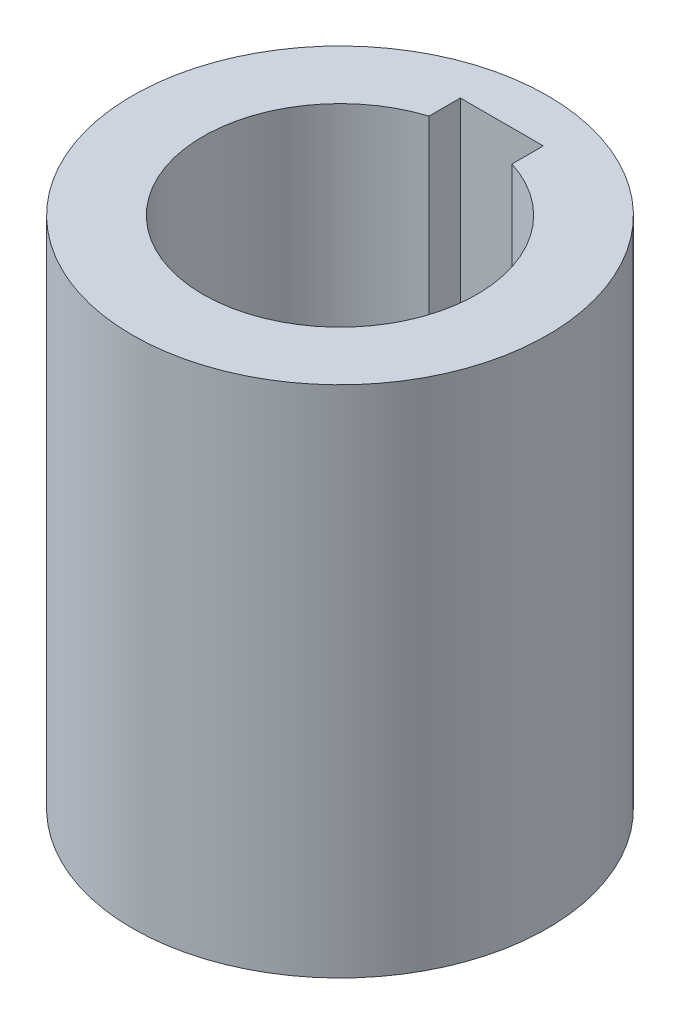
ISO-10303-21;
HEADER;
FILE_DESCRIPTION(('STEP AP214'),'2;1');
FILE_NAME('part.step','',(''),(''),'','','');
FILE_SCHEMA(('AUTOMOTIVE_DESIGN { 1 0 10303 214 1 1 1 1 }'));
ENDSEC;
DATA;
#1=APPLICATION_CONTEXT('core data for automotive mechanical design processes');
#2=APPLICATION_PROTOCOL_DEFINITION('international standard','automotive_design',2000,#1);
#3=PRODUCT_CONTEXT('',#1,'mechanical');
#4=PRODUCT('Part','Part','',(#3));
#5=PRODUCT_RELATED_PRODUCT_CATEGORY('part','',(#4));
#6=PRODUCT_DEFINITION_FORMATION('','',#4);
#7=PRODUCT_DEFINITION_CONTEXT('part definition',#1,'design');
#8=PRODUCT_DEFINITION('design','',#6,#7);
#9=PRODUCT_DEFINITION_SHAPE('','',#8);
#10=(LENGTH_UNIT() NAMED_UNIT(*) SI_UNIT(.MILLI.,.METRE.));
#11=(NAMED_UNIT(*) PLANE_ANGLE_UNIT() SI_UNIT($,.RADIAN.));
#12=(NAMED_UNIT(*) SI_UNIT($,.STERADIAN.) SOLID_ANGLE_UNIT());
#13=UNCERTAINTY_MEASURE_WITH_UNIT(LENGTH_MEASURE(1.E-05),#10,'distance_accuracy_value','');
#14=(GEOMETRIC_REPRESENTATION_CONTEXT(3) GLOBAL_UNCERTAINTY_ASSIGNED_CONTEXT((#13)) GLOBAL_UNIT_ASSIGNED_CONTEXT((#10,
#11,#12)) REPRESENTATION_CONTEXT('',''));
#15=CARTESIAN_POINT('',(0.,0.,0.));
#16=DIRECTION('',(0.,0.,1.));
#17=DIRECTION('',(1.,0.,0.));
#18=AXIS2_PLACEMENT_3D('',#15,#16,#17);
#19=CARTESIAN_POINT('',(0.,123.8,0.));
#20=DIRECTION('',(0.,1.,0.));
#21=DIRECTION('',(0.,0.,1.));
#22=AXIS2_PLACEMENT_3D('',#19,#20,#21);
#23=PLANE('',#22);
#24=DIRECTION('',(0.,0.,-1.));
#25=VECTOR('',#24,1.);
#26=CARTESIAN_POINT('',(10.,123.8,0.));
#27=LINE('',#26,#25);
#28=CARTESIAN_POINT('',(10.,123.8,-31.4483703870328));
#29=VERTEX_POINT('',#28);
#30=CARTESIAN_POINT('',(10.,123.8,-39.));
#31=VERTEX_POINT('',#30);
#32=EDGE_CURVE('E76',#29,#31,#27,.T.);
#33=ORIENTED_EDGE('',*,*,#32,.F.);
#34=CARTESIAN_POINT('',(0.,123.8,0.));
#35=DIRECTION('',(0.,1.,0.));
#36=DIRECTION('',(0.,0.,1.));
#37=AXIS2_PLACEMENT_3D('',#34,#35,#36);
#38=CIRCLE('',#37,33.);
#39=CARTESIAN_POINT('',(-10.,123.8,-31.4483703870328));
#40=VERTEX_POINT('',#39);
#41=EDGE_CURVE('E102',#40,#29,#38,.T.);
#42=ORIENTED_EDGE('',*,*,#41,.F.);
#43=DIRECTION('',(0.,0.,1.));
#44=VECTOR('',#43,1.);
#45=CARTESIAN_POINT('',(-10.,123.8,0.));
#46=LINE('',#45,#44);
#47=CARTESIAN_POINT('',(-10.,123.8,-39.));
#48=VERTEX_POINT('',#47);
#49=EDGE_CURVE('E48',#48,#40,#46,.T.);
#50=ORIENTED_EDGE('',*,*,#49,.F.);
#51=DIRECTION('',(-1.,0.,0.));
#52=VECTOR('',#51,1.);
#53=CARTESIAN_POINT('',(0.,123.8,-39.));
#54=LINE('',#53,#52);
#55=EDGE_CURVE('E100',#31,#48,#54,.T.);
#56=ORIENTED_EDGE('',*,*,#55,.F.);
#57=EDGE_LOOP('',(#33,#42,#50,#56));
#58=FACE_BOUND('',#57,.T.);
#59=CARTESIAN_POINT('',(0.,123.8,0.));
#60=DIRECTION('',(0.,1.,0.));
#61=DIRECTION('',(0.,0.,1.));
#62=AXIS2_PLACEMENT_3D('',#59,#60,#61);
#63=CIRCLE('',#62,50.);
#64=CARTESIAN_POINT('',(0.,123.8,50.));
#65=VERTEX_POINT('',#64);
#66=EDGE_CURVE('E107',#65,#65,#63,.T.);
#67=ORIENTED_EDGE('',*,*,#66,.T.);
#68=EDGE_LOOP('',(#67));
#69=FACE_BOUND('',#68,.T.);
#70=ADVANCED_FACE('F33',(#58,#69),#23,.T.);
#71=CARTESIAN_POINT('',(0.,0.,0.));
#72=DIRECTION('',(0.,1.,0.));
#73=DIRECTION('',(0.,0.,1.));
#74=AXIS2_PLACEMENT_3D('',#71,#72,#73);
#75=PLANE('',#74);
#76=CARTESIAN_POINT('',(0.,0.,0.));
#77=DIRECTION('',(0.,1.,0.));
#78=DIRECTION('',(0.,0.,1.));
#79=AXIS2_PLACEMENT_3D('',#76,#77,#78);
#80=CIRCLE('',#79,33.);
#81=CARTESIAN_POINT('',(-10.,0.,-31.4483703870328));
#82=VERTEX_POINT('',#81);
#83=CARTESIAN_POINT('',(10.,0.,-31.4483703870328));
#84=VERTEX_POINT('',#83);
#85=EDGE_CURVE('E93',#82,#84,#80,.T.);
#86=ORIENTED_EDGE('',*,*,#85,.T.);
#87=DIRECTION('',(0.,0.,-1.));
#88=VECTOR('',#87,1.);
#89=CARTESIAN_POINT('',(10.,0.,-27.));
#90=LINE('',#89,#88);
#91=CARTESIAN_POINT('',(10.,0.,-39.));
#92=VERTEX_POINT('',#91);
#93=EDGE_CURVE('E75',#84,#92,#90,.T.);
#94=ORIENTED_EDGE('',*,*,#93,.T.);
#95=DIRECTION('',(-1.,0.,0.));
#96=VECTOR('',#95,1.);
#97=CARTESIAN_POINT('',(-10.,0.,-39.));
#98=LINE('',#97,#96);
#99=CARTESIAN_POINT('',(-10.,0.,-39.));
#100=VERTEX_POINT('',#99);
#101=EDGE_CURVE('E83',#92,#100,#98,.T.);
#102=ORIENTED_EDGE('',*,*,#101,.T.);
#103=DIRECTION('',(0.,0.,1.));
#104=VECTOR('',#103,1.);
#105=CARTESIAN_POINT('',(-10.,0.,-27.));
#106=LINE('',#105,#104);
#107=EDGE_CURVE('E80',#100,#82,#106,.T.);
#108=ORIENTED_EDGE('',*,*,#107,.T.);
#109=EDGE_LOOP('',(#86,#94,#102,#108));
#110=FACE_BOUND('',#109,.T.);
#111=CARTESIAN_POINT('',(0.,0.,0.));
#112=DIRECTION('',(0.,1.,0.));
#113=DIRECTION('',(0.,0.,1.));
#114=AXIS2_PLACEMENT_3D('',#111,#112,#113);
#115=CIRCLE('',#114,50.);
#116=CARTESIAN_POINT('',(0.,0.,50.));
#117=VERTEX_POINT('',#116);
#118=EDGE_CURVE('E105',#117,#117,#115,.T.);
#119=ORIENTED_EDGE('',*,*,#118,.F.);
#120=EDGE_LOOP('',(#119));
#121=FACE_BOUND('',#120,.T.);
#122=ADVANCED_FACE('F90',(#110,#121),#75,.F.);
#123=CARTESIAN_POINT('',(0.,123.8,0.));
#124=DIRECTION('',(0.,-1.,0.));
#125=DIRECTION('',(0.,0.,-1.));
#126=AXIS2_PLACEMENT_3D('',#123,#124,#125);
#127=CYLINDRICAL_SURFACE('',#126,50.);
#128=ORIENTED_EDGE('',*,*,#66,.F.);
#129=EDGE_LOOP('',(#128));
#130=FACE_BOUND('',#129,.T.);
#131=ORIENTED_EDGE('',*,*,#118,.T.);
#132=EDGE_LOOP('',(#131));
#133=FACE_BOUND('',#132,.T.);
#134=ADVANCED_FACE('F35',(#130,#133),#127,.T.);
#135=CARTESIAN_POINT('',(0.,123.8,0.));
#136=DIRECTION('',(0.,-1.,0.));
#137=DIRECTION('',(0.,0.,-1.));
#138=AXIS2_PLACEMENT_3D('',#135,#136,#137);
#139=CYLINDRICAL_SURFACE('',#138,33.);
#140=DIRECTION('',(0.,-1.,0.));
#141=VECTOR('',#140,1.);
#142=CARTESIAN_POINT('',(10.,123.8,-31.4483703870328));
#143=LINE('',#142,#141);
#144=EDGE_CURVE('E11',#84,#29,#143,.F.);
#145=ORIENTED_EDGE('',*,*,#144,.F.);
#146=ORIENTED_EDGE('',*,*,#85,.F.);
#147=DIRECTION('',(0.,-1.,0.));
#148=VECTOR('',#147,1.);
#149=CARTESIAN_POINT('',(-10.,123.8,-31.4483703870328));
#150=LINE('',#149,#148);
#151=EDGE_CURVE('E41',#40,#82,#150,.T.);
#152=ORIENTED_EDGE('',*,*,#151,.F.);
#153=ORIENTED_EDGE('',*,*,#41,.T.);
#154=EDGE_LOOP('',(#145,#146,#152,#153));
#155=FACE_BOUND('',#154,.T.);
#156=ADVANCED_FACE('F114',(#155),#139,.F.);
#157=CARTESIAN_POINT('',(10.,0.,-27.));
#158=DIRECTION('',(1.,0.,0.));
#159=DIRECTION('',(0.,0.,-1.));
#160=AXIS2_PLACEMENT_3D('',#157,#158,#159);
#161=PLANE('',#160);
#162=ORIENTED_EDGE('',*,*,#32,.T.);
#163=DIRECTION('',(0.,1.,0.));
#164=VECTOR('',#163,1.);
#165=CARTESIAN_POINT('',(10.,0.,-39.));
#166=LINE('',#165,#164);
#167=EDGE_CURVE('E71',#92,#31,#166,.T.);
#168=ORIENTED_EDGE('',*,*,#167,.F.);
#169=ORIENTED_EDGE('',*,*,#93,.F.);
#170=ORIENTED_EDGE('',*,*,#144,.T.);
#171=EDGE_LOOP('',(#162,#168,#169,#170));
#172=FACE_BOUND('',#171,.T.);
#173=ADVANCED_FACE('F73',(#172),#161,.F.);
#174=CARTESIAN_POINT('',(-10.,0.,-27.));
#175=DIRECTION('',(-1.,0.,0.));
#176=DIRECTION('',(0.,0.,1.));
#177=AXIS2_PLACEMENT_3D('',#174,#175,#176);
#178=PLANE('',#177);
#179=ORIENTED_EDGE('',*,*,#49,.T.);
#180=ORIENTED_EDGE('',*,*,#151,.T.);
#181=ORIENTED_EDGE('',*,*,#107,.F.);
#182=DIRECTION('',(0.,1.,0.));
#183=VECTOR('',#182,1.);
#184=CARTESIAN_POINT('',(-10.,0.,-39.));
#185=LINE('',#184,#183);
#186=EDGE_CURVE('E79',#100,#48,#185,.T.);
#187=ORIENTED_EDGE('',*,*,#186,.T.);
#188=EDGE_LOOP('',(#179,#180,#181,#187));
#189=FACE_BOUND('',#188,.T.);
#190=ADVANCED_FACE('F111',(#189),#178,.F.);
#191=CARTESIAN_POINT('',(-10.,0.,-39.));
#192=DIRECTION('',(0.,0.,-1.));
#193=DIRECTION('',(-1.,0.,0.));
#194=AXIS2_PLACEMENT_3D('',#191,#192,#193);
#195=PLANE('',#194);
#196=ORIENTED_EDGE('',*,*,#55,.T.);
#197=ORIENTED_EDGE('',*,*,#186,.F.);
#198=ORIENTED_EDGE('',*,*,#101,.F.);
#199=ORIENTED_EDGE('',*,*,#167,.T.);
#200=EDGE_LOOP('',(#196,#197,#198,#199));
#201=FACE_BOUND('',#200,.T.);
#202=ADVANCED_FACE('F84',(#201),#195,.F.);
#203=CLOSED_SHELL('',(#70,#122,#134,#156,#173,#190,#202));
#204=MANIFOLD_SOLID_BREP('B2',#203);
#205=ADVANCED_BREP_SHAPE_REPRESENTATION('',(#18,#204),#14);
#206=SHAPE_DEFINITION_REPRESENTATION(#9,#205);
ENDSEC;
END-ISO-10303-21;
